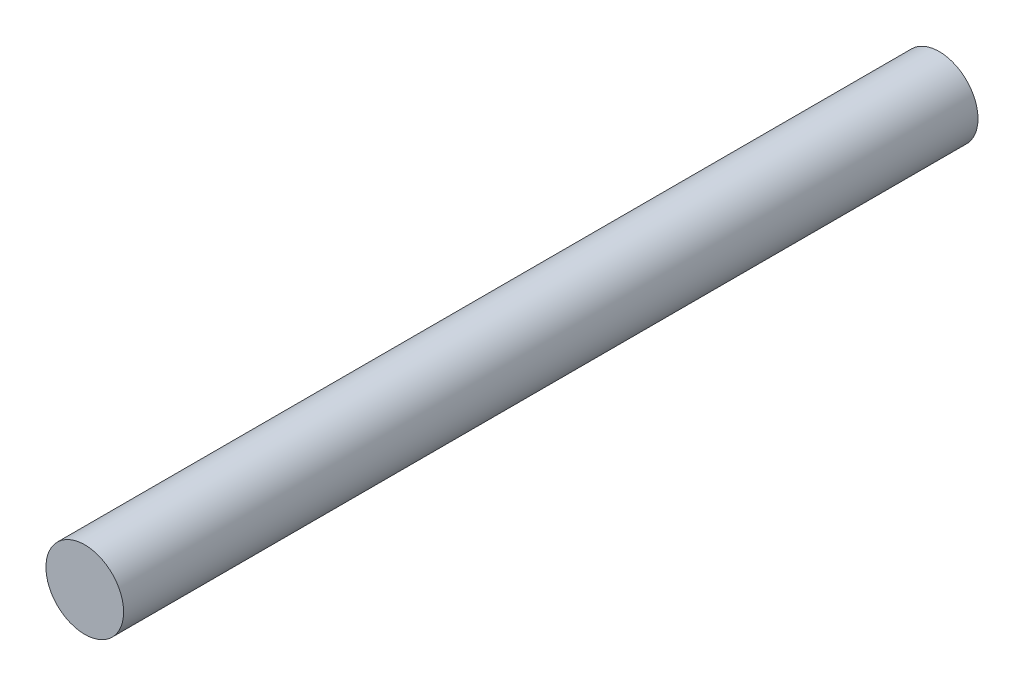
ISO-10303-21;
HEADER;
FILE_DESCRIPTION(('STEP AP214'),'2;1');
FILE_NAME('part.step','',(''),(''),'','','');
FILE_SCHEMA(('AUTOMOTIVE_DESIGN { 1 0 10303 214 1 1 1 1 }'));
ENDSEC;
DATA;
#1=APPLICATION_CONTEXT('core data for automotive mechanical design processes');
#2=APPLICATION_PROTOCOL_DEFINITION('international standard','automotive_design',2000,#1);
#3=PRODUCT_CONTEXT('',#1,'mechanical');
#4=PRODUCT('Part','Part','',(#3));
#5=PRODUCT_RELATED_PRODUCT_CATEGORY('part','',(#4));
#6=PRODUCT_DEFINITION_FORMATION('','',#4);
#7=PRODUCT_DEFINITION_CONTEXT('part definition',#1,'design');
#8=PRODUCT_DEFINITION('design','',#6,#7);
#9=PRODUCT_DEFINITION_SHAPE('','',#8);
#10=(LENGTH_UNIT() NAMED_UNIT(*) SI_UNIT(.MILLI.,.METRE.));
#11=(NAMED_UNIT(*) PLANE_ANGLE_UNIT() SI_UNIT($,.RADIAN.));
#12=(NAMED_UNIT(*) SI_UNIT($,.STERADIAN.) SOLID_ANGLE_UNIT());
#13=UNCERTAINTY_MEASURE_WITH_UNIT(LENGTH_MEASURE(1.E-05),#10,'distance_accuracy_value','');
#14=(GEOMETRIC_REPRESENTATION_CONTEXT(3) GLOBAL_UNCERTAINTY_ASSIGNED_CONTEXT((#13)) GLOBAL_UNIT_ASSIGNED_CONTEXT((#10,
#11,#12)) REPRESENTATION_CONTEXT('',''));
#15=CARTESIAN_POINT('',(0.,0.,0.));
#16=DIRECTION('',(0.,0.,1.));
#17=DIRECTION('',(1.,0.,0.));
#18=AXIS2_PLACEMENT_3D('',#15,#16,#17);
#19=CARTESIAN_POINT('',(0.,0.,132.));
#20=DIRECTION('',(0.,0.,-1.));
#21=DIRECTION('',(-1.,0.,0.));
#22=AXIS2_PLACEMENT_3D('',#19,#20,#21);
#23=CYLINDRICAL_SURFACE('',#22,12.);
#24=CARTESIAN_POINT('',(0.,0.,132.));
#25=DIRECTION('',(0.,0.,1.));
#26=DIRECTION('',(1.,0.,0.));
#27=AXIS2_PLACEMENT_3D('',#24,#25,#26);
#28=CIRCLE('',#27,12.);
#29=CARTESIAN_POINT('',(12.,0.,132.));
#30=VERTEX_POINT('',#29);
#31=EDGE_CURVE('E10',#30,#30,#28,.T.);
#32=ORIENTED_EDGE('',*,*,#31,.F.);
#33=EDGE_LOOP('',(#32));
#34=FACE_BOUND('',#33,.T.);
#35=CARTESIAN_POINT('',(0.,0.,-132.));
#36=DIRECTION('',(0.,0.,1.));
#37=DIRECTION('',(1.,0.,0.));
#38=AXIS2_PLACEMENT_3D('',#35,#36,#37);
#39=CIRCLE('',#38,12.);
#40=CARTESIAN_POINT('',(12.,0.,-132.));
#41=VERTEX_POINT('',#40);
#42=EDGE_CURVE('E38',#41,#41,#39,.T.);
#43=ORIENTED_EDGE('',*,*,#42,.T.);
#44=EDGE_LOOP('',(#43));
#45=FACE_BOUND('',#44,.T.);
#46=ADVANCED_FACE('F35',(#34,#45),#23,.T.);
#47=CARTESIAN_POINT('',(0.,0.,132.));
#48=DIRECTION('',(0.,0.,1.));
#49=DIRECTION('',(1.,0.,0.));
#50=AXIS2_PLACEMENT_3D('',#47,#48,#49);
#51=PLANE('',#50);
#52=ORIENTED_EDGE('',*,*,#31,.T.);
#53=EDGE_LOOP('',(#52));
#54=FACE_BOUND('',#53,.T.);
#55=ADVANCED_FACE('F50',(#54),#51,.T.);
#56=CARTESIAN_POINT('',(0.,0.,-132.));
#57=DIRECTION('',(0.,0.,1.));
#58=DIRECTION('',(1.,0.,0.));
#59=AXIS2_PLACEMENT_3D('',#56,#57,#58);
#60=PLANE('',#59);
#61=ORIENTED_EDGE('',*,*,#42,.F.);
#62=EDGE_LOOP('',(#61));
#63=FACE_BOUND('',#62,.T.);
#64=ADVANCED_FACE('F48',(#63),#60,.F.);
#65=CLOSED_SHELL('',(#46,#55,#64));
#66=MANIFOLD_SOLID_BREP('B2',#65);
#67=ADVANCED_BREP_SHAPE_REPRESENTATION('',(#18,#66),#14);
#68=SHAPE_DEFINITION_REPRESENTATION(#9,#67);
ENDSEC;
END-ISO-10303-21;
